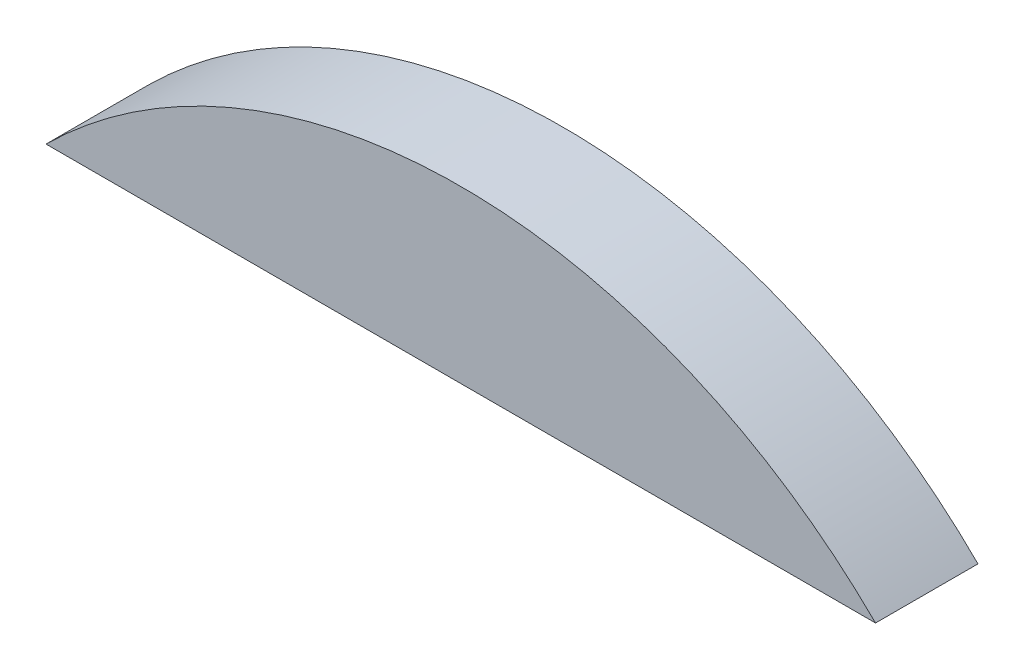
ISO-10303-21;
HEADER;
FILE_DESCRIPTION(('STEP AP214'),'2;1');
FILE_NAME('part.step','',(''),(''),'','','');
FILE_SCHEMA(('AUTOMOTIVE_DESIGN { 1 0 10303 214 1 1 1 1 }'));
ENDSEC;
DATA;
#1=APPLICATION_CONTEXT('core data for automotive mechanical design processes');
#2=APPLICATION_PROTOCOL_DEFINITION('international standard','automotive_design',2000,#1);
#3=PRODUCT_CONTEXT('',#1,'mechanical');
#4=PRODUCT('Part','Part','',(#3));
#5=PRODUCT_RELATED_PRODUCT_CATEGORY('part','',(#4));
#6=PRODUCT_DEFINITION_FORMATION('','',#4);
#7=PRODUCT_DEFINITION_CONTEXT('part definition',#1,'design');
#8=PRODUCT_DEFINITION('design','',#6,#7);
#9=PRODUCT_DEFINITION_SHAPE('','',#8);
#10=(LENGTH_UNIT() NAMED_UNIT(*) SI_UNIT(.MILLI.,.METRE.));
#11=(NAMED_UNIT(*) PLANE_ANGLE_UNIT() SI_UNIT($,.RADIAN.));
#12=(NAMED_UNIT(*) SI_UNIT($,.STERADIAN.) SOLID_ANGLE_UNIT());
#13=UNCERTAINTY_MEASURE_WITH_UNIT(LENGTH_MEASURE(1.E-05),#10,'distance_accuracy_value','');
#14=(GEOMETRIC_REPRESENTATION_CONTEXT(3) GLOBAL_UNCERTAINTY_ASSIGNED_CONTEXT((#13)) GLOBAL_UNIT_ASSIGNED_CONTEXT((#10,
#11,#12)) REPRESENTATION_CONTEXT('',''));
#15=CARTESIAN_POINT('',(0.,0.,0.));
#16=DIRECTION('',(0.,0.,1.));
#17=DIRECTION('',(1.,0.,0.));
#18=AXIS2_PLACEMENT_3D('',#15,#16,#17);
#19=CARTESIAN_POINT('',(0.,0.,-30.));
#20=DIRECTION('',(0.,0.,1.));
#21=DIRECTION('',(1.,0.,0.));
#22=AXIS2_PLACEMENT_3D('',#19,#20,#21);
#23=CYLINDRICAL_SURFACE('',#22,172.5);
#24=CARTESIAN_POINT('',(0.,0.,0.));
#25=DIRECTION('',(0.,0.,1.));
#26=DIRECTION('',(1.,0.,0.));
#27=AXIS2_PLACEMENT_3D('',#24,#25,#26);
#28=CIRCLE('',#27,172.5);
#29=CARTESIAN_POINT('',(-121.449578014911,122.5,0.));
#30=VERTEX_POINT('',#29);
#31=CARTESIAN_POINT('',(121.449578014911,122.5,0.));
#32=VERTEX_POINT('',#31);
#33=EDGE_CURVE('E68',#30,#32,#28,.F.);
#34=ORIENTED_EDGE('',*,*,#33,.T.);
#35=DIRECTION('',(0.,0.,1.));
#36=VECTOR('',#35,1.);
#37=CARTESIAN_POINT('',(121.449578014911,122.5,-30.));
#38=LINE('',#37,#36);
#39=CARTESIAN_POINT('',(121.449578014911,122.5,-30.));
#40=VERTEX_POINT('',#39);
#41=EDGE_CURVE('E11',#40,#32,#38,.T.);
#42=ORIENTED_EDGE('',*,*,#41,.F.);
#43=CARTESIAN_POINT('',(0.,0.,-30.));
#44=DIRECTION('',(0.,0.,1.));
#45=DIRECTION('',(1.,0.,0.));
#46=AXIS2_PLACEMENT_3D('',#43,#44,#45);
#47=CIRCLE('',#46,172.5);
#48=CARTESIAN_POINT('',(-121.449578014911,122.5,-30.));
#49=VERTEX_POINT('',#48);
#50=EDGE_CURVE('E52',#49,#40,#47,.F.);
#51=ORIENTED_EDGE('',*,*,#50,.F.);
#52=DIRECTION('',(0.,0.,1.));
#53=VECTOR('',#52,1.);
#54=CARTESIAN_POINT('',(-121.449578014911,122.5,-30.));
#55=LINE('',#54,#53);
#56=EDGE_CURVE('E40',#49,#30,#55,.T.);
#57=ORIENTED_EDGE('',*,*,#56,.T.);
#58=EDGE_LOOP('',(#34,#42,#51,#57));
#59=FACE_BOUND('',#58,.T.);
#60=ADVANCED_FACE('F37',(#59),#23,.T.);
#61=CARTESIAN_POINT('',(0.,122.5,-30.));
#62=DIRECTION('',(0.,-1.,0.));
#63=DIRECTION('',(0.,0.,-1.));
#64=AXIS2_PLACEMENT_3D('',#61,#62,#63);
#65=PLANE('',#64);
#66=DIRECTION('',(1.,0.,0.));
#67=VECTOR('',#66,1.);
#68=CARTESIAN_POINT('',(0.,122.5,0.));
#69=LINE('',#68,#67);
#70=EDGE_CURVE('E66',#30,#32,#69,.T.);
#71=ORIENTED_EDGE('',*,*,#70,.F.);
#72=ORIENTED_EDGE('',*,*,#56,.F.);
#73=DIRECTION('',(1.,0.,0.));
#74=VECTOR('',#73,1.);
#75=CARTESIAN_POINT('',(0.,122.5,-30.));
#76=LINE('',#75,#74);
#77=EDGE_CURVE('E67',#49,#40,#76,.T.);
#78=ORIENTED_EDGE('',*,*,#77,.T.);
#79=ORIENTED_EDGE('',*,*,#41,.T.);
#80=EDGE_LOOP('',(#71,#72,#78,#79));
#81=FACE_BOUND('',#80,.T.);
#82=ADVANCED_FACE('F64',(#81),#65,.T.);
#83=CARTESIAN_POINT('',(0.,0.,-30.));
#84=DIRECTION('',(0.,0.,1.));
#85=DIRECTION('',(1.,0.,0.));
#86=AXIS2_PLACEMENT_3D('',#83,#84,#85);
#87=PLANE('',#86);
#88=ORIENTED_EDGE('',*,*,#50,.T.);
#89=ORIENTED_EDGE('',*,*,#77,.F.);
#90=EDGE_LOOP('',(#88,#89));
#91=FACE_BOUND('',#90,.T.);
#92=ADVANCED_FACE('F76',(#91),#87,.F.);
#93=CARTESIAN_POINT('',(0.,0.,0.));
#94=DIRECTION('',(0.,0.,1.));
#95=DIRECTION('',(1.,0.,0.));
#96=AXIS2_PLACEMENT_3D('',#93,#94,#95);
#97=PLANE('',#96);
#98=ORIENTED_EDGE('',*,*,#33,.F.);
#99=ORIENTED_EDGE('',*,*,#70,.T.);
#100=EDGE_LOOP('',(#98,#99));
#101=FACE_BOUND('',#100,.T.);
#102=ADVANCED_FACE('F71',(#101),#97,.T.);
#103=CLOSED_SHELL('',(#60,#82,#92,#102));
#104=MANIFOLD_SOLID_BREP('B2',#103);
#105=ADVANCED_BREP_SHAPE_REPRESENTATION('',(#18,#104),#14);
#106=SHAPE_DEFINITION_REPRESENTATION(#9,#105);
ENDSEC;
END-ISO-10303-21;
